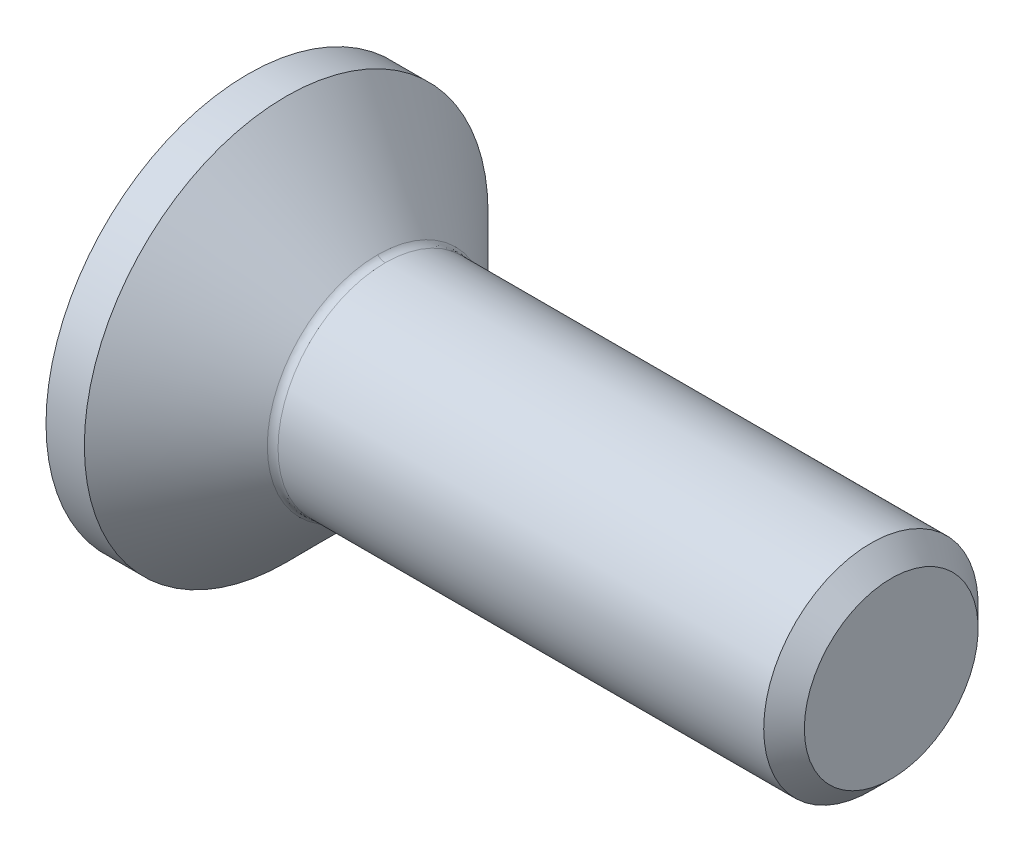
ISO-10303-21;
HEADER;
FILE_DESCRIPTION(('STEP AP214'),'2;1');
FILE_NAME('part.step','',(''),(''),'','','');
FILE_SCHEMA(('AUTOMOTIVE_DESIGN { 1 0 10303 214 1 1 1 1 }'));
ENDSEC;
DATA;
#1=APPLICATION_CONTEXT('core data for automotive mechanical design processes');
#2=APPLICATION_PROTOCOL_DEFINITION('international standard','automotive_design',2000,#1);
#3=PRODUCT_CONTEXT('',#1,'mechanical');
#4=PRODUCT('Part','Part','',(#3));
#5=PRODUCT_RELATED_PRODUCT_CATEGORY('part','',(#4));
#6=PRODUCT_DEFINITION_FORMATION('','',#4);
#7=PRODUCT_DEFINITION_CONTEXT('part definition',#1,'design');
#8=PRODUCT_DEFINITION('design','',#6,#7);
#9=PRODUCT_DEFINITION_SHAPE('','',#8);
#10=(LENGTH_UNIT() NAMED_UNIT(*) SI_UNIT(.MILLI.,.METRE.));
#11=(NAMED_UNIT(*) PLANE_ANGLE_UNIT() SI_UNIT($,.RADIAN.));
#12=(NAMED_UNIT(*) SI_UNIT($,.STERADIAN.) SOLID_ANGLE_UNIT());
#13=UNCERTAINTY_MEASURE_WITH_UNIT(LENGTH_MEASURE(1.E-05),#10,'distance_accuracy_value','');
#14=(GEOMETRIC_REPRESENTATION_CONTEXT(3) GLOBAL_UNCERTAINTY_ASSIGNED_CONTEXT((#13)) GLOBAL_UNIT_ASSIGNED_CONTEXT((#10,
#11,#12)) REPRESENTATION_CONTEXT('',''));
#15=CARTESIAN_POINT('',(0.,0.,0.));
#16=DIRECTION('',(0.,0.,1.));
#17=DIRECTION('',(1.,0.,0.));
#18=AXIS2_PLACEMENT_3D('',#15,#16,#17);
#19=CARTESIAN_POINT('',(1.5,0.,-1.44337567297406));
#20=DIRECTION('',(1.,0.,0.));
#21=DIRECTION('',(0.,1.,0.));
#22=AXIS2_PLACEMENT_3D('',#19,#20,#21);
#23=PLANE('',#22);
#24=CARTESIAN_POINT('',(1.50000000003137,0.,0.));
#25=DIRECTION('',(-1.,0.,0.));
#26=DIRECTION('',(0.,0.,1.));
#27=AXIS2_PLACEMENT_3D('',#24,#25,#26);
#28=CIRCLE('',#27,1.25);
#29=CARTESIAN_POINT('',(1.50000000001604,0.625000000006822,-1.08253175474236));
#30=VERTEX_POINT('',#29);
#31=CARTESIAN_POINT('',(1.50000000001604,-0.62500000000682,-1.08253175474236));
#32=VERTEX_POINT('',#31);
#33=EDGE_CURVE('E26',#30,#32,#28,.T.);
#34=ORIENTED_EDGE('',*,*,#33,.F.);
#35=DIRECTION('',(0.,0.866025403784436,0.5));
#36=VECTOR('',#35,1.);
#37=CARTESIAN_POINT('',(1.50000000001001,0.,-1.44337567298406));
#38=LINE('',#37,#36);
#39=CARTESIAN_POINT('',(1.50000000000535,0.,-1.44337567297406));
#40=VERTEX_POINT('',#39);
#41=EDGE_CURVE('E191',#40,#30,#38,.T.);
#42=ORIENTED_EDGE('',*,*,#41,.F.);
#43=DIRECTION('',(0.,0.866025403784437,-0.5));
#44=VECTOR('',#43,1.);
#45=CARTESIAN_POINT('',(1.5000000000207,-1.25000000001,-0.721687836497033));
#46=LINE('',#45,#44);
#47=EDGE_CURVE('E152',#32,#40,#46,.T.);
#48=ORIENTED_EDGE('',*,*,#47,.F.);
#49=EDGE_LOOP('',(#34,#42,#48));
#50=FACE_BOUND('',#49,.T.);
#51=ADVANCED_FACE('F15',(#50),#23,.F.);
#52=CARTESIAN_POINT('',(1.5,-1.25,0.721687836487032));
#53=DIRECTION('',(0.,1.,0.));
#54=DIRECTION('',(1.,0.,0.));
#55=AXIS2_PLACEMENT_3D('',#52,#53,#54);
#56=PLANE('',#55);
#57=DIRECTION('',(-1.,0.,0.));
#58=VECTOR('',#57,1.);
#59=CARTESIAN_POINT('',(1.50000000001,-1.25000000001,-0.721687836497035));
#60=LINE('',#59,#58);
#61=CARTESIAN_POINT('',(1.50000000000536,-1.25000000000227,-0.721687836485721));
#62=VERTEX_POINT('',#61);
#63=CARTESIAN_POINT('',(0.,-1.25,-0.721687836487034));
#64=VERTEX_POINT('',#63);
#65=EDGE_CURVE('E143',#62,#64,#60,.T.);
#66=ORIENTED_EDGE('',*,*,#65,.T.);
#67=DIRECTION('',(0.,0.,1.));
#68=VECTOR('',#67,1.);
#69=CARTESIAN_POINT('',(0.,-1.25000000001,0.));
#70=LINE('',#69,#68);
#71=CARTESIAN_POINT('',(0.,-1.25,0.721687836487032));
#72=VERTEX_POINT('',#71);
#73=EDGE_CURVE('E128',#64,#72,#70,.T.);
#74=ORIENTED_EDGE('',*,*,#73,.T.);
#75=DIRECTION('',(-1.,0.,0.));
#76=VECTOR('',#75,1.);
#77=CARTESIAN_POINT('',(1.50000000001,-1.25000000001,0.721687836497032));
#78=LINE('',#77,#76);
#79=CARTESIAN_POINT('',(1.50000000000536,-1.25,0.721687836487032));
#80=VERTEX_POINT('',#79);
#81=EDGE_CURVE('E10',#80,#72,#78,.T.);
#82=ORIENTED_EDGE('',*,*,#81,.F.);
#83=DIRECTION('',(0.,0.,-1.));
#84=VECTOR('',#83,1.);
#85=CARTESIAN_POINT('',(1.50000000001001,-1.25000000001,0.721687836497032));
#86=LINE('',#85,#84);
#87=CARTESIAN_POINT('',(1.50000000001604,-1.25000000001364,0.));
#88=VERTEX_POINT('',#87);
#89=EDGE_CURVE('E171',#80,#88,#86,.T.);
#90=ORIENTED_EDGE('',*,*,#89,.T.);
#91=DIRECTION('',(0.,0.,-1.));
#92=VECTOR('',#91,1.);
#93=CARTESIAN_POINT('',(1.5000000000207,-1.25000000001,0.721687836497032));
#94=LINE('',#93,#92);
#95=EDGE_CURVE('E147',#88,#62,#94,.T.);
#96=ORIENTED_EDGE('',*,*,#95,.T.);
#97=EDGE_LOOP('',(#66,#74,#82,#90,#96));
#98=FACE_BOUND('',#97,.T.);
#99=ADVANCED_FACE('F144',(#98),#56,.T.);
#100=CARTESIAN_POINT('',(1.5,0.,1.44337567297406));
#101=DIRECTION('',(0.,0.5,-0.866025403784438));
#102=DIRECTION('',(-1.,0.,0.));
#103=AXIS2_PLACEMENT_3D('',#100,#101,#102);
#104=PLANE('',#103);
#105=ORIENTED_EDGE('',*,*,#81,.T.);
#106=DIRECTION('',(0.,0.866025403784436,0.5));
#107=VECTOR('',#106,1.);
#108=CARTESIAN_POINT('',(0.,-1.25000000001,0.721687836497032));
#109=LINE('',#108,#107);
#110=CARTESIAN_POINT('',(0.,0.,1.44337567297406));
#111=VERTEX_POINT('',#110);
#112=EDGE_CURVE('E137',#72,#111,#109,.T.);
#113=ORIENTED_EDGE('',*,*,#112,.T.);
#114=DIRECTION('',(-1.,0.,0.));
#115=VECTOR('',#114,1.);
#116=CARTESIAN_POINT('',(1.50000000001,0.,1.44337567298407));
#117=LINE('',#116,#115);
#118=CARTESIAN_POINT('',(1.50000000000536,0.,1.44337567297406));
#119=VERTEX_POINT('',#118);
#120=EDGE_CURVE('E188',#119,#111,#117,.T.);
#121=ORIENTED_EDGE('',*,*,#120,.F.);
#122=DIRECTION('',(0.,-0.866025403784436,-0.5));
#123=VECTOR('',#122,1.);
#124=CARTESIAN_POINT('',(1.50000000001001,0.,1.44337567298406));
#125=LINE('',#124,#123);
#126=CARTESIAN_POINT('',(1.50000000001604,-0.625000000006822,1.08253175474236));
#127=VERTEX_POINT('',#126);
#128=EDGE_CURVE('E176',#119,#127,#125,.T.);
#129=ORIENTED_EDGE('',*,*,#128,.T.);
#130=DIRECTION('',(0.,-0.866025403784436,-0.5));
#131=VECTOR('',#130,1.);
#132=CARTESIAN_POINT('',(1.5000000000207,0.,1.44337567298406));
#133=LINE('',#132,#131);
#134=EDGE_CURVE('E168',#127,#80,#133,.T.);
#135=ORIENTED_EDGE('',*,*,#134,.T.);
#136=EDGE_LOOP('',(#105,#113,#121,#129,#135));
#137=FACE_BOUND('',#136,.T.);
#138=ADVANCED_FACE('F307',(#137),#104,.T.);
#139=CARTESIAN_POINT('',(1.5,1.25,-0.721687836487031));
#140=DIRECTION('',(0.,-1.,0.));
#141=DIRECTION('',(0.,0.,-1.));
#142=AXIS2_PLACEMENT_3D('',#139,#140,#141);
#143=PLANE('',#142);
#144=DIRECTION('',(-1.,0.,0.));
#145=VECTOR('',#144,1.);
#146=CARTESIAN_POINT('',(1.50000000001,1.25000000001,0.721687836497033));
#147=LINE('',#146,#145);
#148=CARTESIAN_POINT('',(1.50000000000091,1.24999999999867,0.721687836487799));
#149=VERTEX_POINT('',#148);
#150=CARTESIAN_POINT('',(0.,1.25,0.721687836487032));
#151=VERTEX_POINT('',#150);
#152=EDGE_CURVE('E187',#149,#151,#147,.T.);
#153=ORIENTED_EDGE('',*,*,#152,.T.);
#154=DIRECTION('',(0.,0.,-1.));
#155=VECTOR('',#154,1.);
#156=CARTESIAN_POINT('',(0.,1.25000000001,0.));
#157=LINE('',#156,#155);
#158=CARTESIAN_POINT('',(0.,1.25,-0.721687836487031));
#159=VERTEX_POINT('',#158);
#160=EDGE_CURVE('E140',#151,#159,#157,.T.);
#161=ORIENTED_EDGE('',*,*,#160,.T.);
#162=DIRECTION('',(1.,0.,0.));
#163=VECTOR('',#162,1.);
#164=CARTESIAN_POINT('',(1.50000000001,1.25000000001,-0.721687836497031));
#165=LINE('',#164,#163);
#166=CARTESIAN_POINT('',(1.50000000000357,1.25,-0.721687836487031));
#167=VERTEX_POINT('',#166);
#168=EDGE_CURVE('E267',#159,#167,#165,.T.);
#169=ORIENTED_EDGE('',*,*,#168,.T.);
#170=DIRECTION('',(0.,0.,1.));
#171=VECTOR('',#170,1.);
#172=CARTESIAN_POINT('',(1.50000000001001,1.25000000001,-0.721687836497031));
#173=LINE('',#172,#171);
#174=CARTESIAN_POINT('',(1.5000000000116,1.25000000001364,0.));
#175=VERTEX_POINT('',#174);
#176=EDGE_CURVE('E204',#167,#175,#173,.T.);
#177=ORIENTED_EDGE('',*,*,#176,.T.);
#178=DIRECTION('',(0.,0.,1.));
#179=VECTOR('',#178,1.);
#180=CARTESIAN_POINT('',(1.50000000001182,1.25000000001,-0.721687836497031));
#181=LINE('',#180,#179);
#182=EDGE_CURVE('E234',#175,#149,#181,.T.);
#183=ORIENTED_EDGE('',*,*,#182,.T.);
#184=EDGE_LOOP('',(#153,#161,#169,#177,#183));
#185=FACE_BOUND('',#184,.T.);
#186=ADVANCED_FACE('F424',(#185),#143,.T.);
#187=CARTESIAN_POINT('',(1.50000000002137,0.,0.));
#188=DIRECTION('',(-1.,0.,0.));
#189=DIRECTION('',(0.,0.,1.));
#190=AXIS2_PLACEMENT_3D('',#187,#188,#189);
#191=CONICAL_SURFACE('',#190,1.25,1.047197551);
#192=CARTESIAN_POINT('',(2.22168783665211,0.,0.));
#193=VERTEX_POINT('',#192);
#194=VERTEX_LOOP('',#193);
#195=FACE_BOUND('',#194,.T.);
#196=CARTESIAN_POINT('',(1.50000000003137,0.,0.));
#197=DIRECTION('',(-1.,0.,0.));
#198=DIRECTION('',(0.,0.,1.));
#199=AXIS2_PLACEMENT_3D('',#196,#197,#198);
#200=CIRCLE('',#199,1.25);
#201=CARTESIAN_POINT('',(1.50000000001604,0.625000000006821,1.08253175474236));
#202=VERTEX_POINT('',#201);
#203=EDGE_CURVE('E172',#127,#202,#200,.T.);
#204=ORIENTED_EDGE('',*,*,#203,.T.);
#205=CARTESIAN_POINT('',(1.50000000003137,0.,0.));
#206=DIRECTION('',(-1.,0.,0.));
#207=DIRECTION('',(0.,0.,1.));
#208=AXIS2_PLACEMENT_3D('',#205,#206,#207);
#209=CIRCLE('',#208,1.25);
#210=EDGE_CURVE('E236',#202,#175,#209,.T.);
#211=ORIENTED_EDGE('',*,*,#210,.T.);
#212=CARTESIAN_POINT('',(1.50000000003137,0.,0.));
#213=DIRECTION('',(-1.,0.,0.));
#214=DIRECTION('',(0.,0.,1.));
#215=AXIS2_PLACEMENT_3D('',#212,#213,#214);
#216=CIRCLE('',#215,1.25);
#217=EDGE_CURVE('E209',#175,#30,#216,.T.);
#218=ORIENTED_EDGE('',*,*,#217,.T.);
#219=ORIENTED_EDGE('',*,*,#33,.T.);
#220=CARTESIAN_POINT('',(1.50000000003137,0.,0.));
#221=DIRECTION('',(-1.,0.,0.));
#222=DIRECTION('',(0.,0.,1.));
#223=AXIS2_PLACEMENT_3D('',#220,#221,#222);
#224=CIRCLE('',#223,1.25);
#225=EDGE_CURVE('E195',#32,#88,#224,.T.);
#226=ORIENTED_EDGE('',*,*,#225,.T.);
#227=CARTESIAN_POINT('',(1.50000000003137,0.,0.));
#228=DIRECTION('',(-1.,0.,0.));
#229=DIRECTION('',(0.,0.,1.));
#230=AXIS2_PLACEMENT_3D('',#227,#228,#229);
#231=CIRCLE('',#230,1.25);
#232=EDGE_CURVE('E213',#88,#127,#231,.T.);
#233=ORIENTED_EDGE('',*,*,#232,.T.);
#234=EDGE_LOOP('',(#204,#211,#218,#219,#226,#233));
#235=FACE_BOUND('',#234,.T.);
#236=ADVANCED_FACE('F249',(#195,#235),#191,.F.);
#237=CARTESIAN_POINT('',(1.5,0.,-1.44337567297406));
#238=DIRECTION('',(1.,0.,0.));
#239=DIRECTION('',(0.,1.,0.));
#240=AXIS2_PLACEMENT_3D('',#237,#238,#239);
#241=PLANE('',#240);
#242=ORIENTED_EDGE('',*,*,#210,.F.);
#243=DIRECTION('',(0.,-0.866025403784436,0.5));
#244=VECTOR('',#243,1.);
#245=CARTESIAN_POINT('',(1.50000000001001,1.25000000001,0.721687836497032));
#246=LINE('',#245,#244);
#247=EDGE_CURVE('E164',#149,#202,#246,.T.);
#248=ORIENTED_EDGE('',*,*,#247,.F.);
#249=ORIENTED_EDGE('',*,*,#182,.F.);
#250=EDGE_LOOP('',(#242,#248,#249));
#251=FACE_BOUND('',#250,.T.);
#252=ADVANCED_FACE('F482',(#251),#241,.F.);
#253=CARTESIAN_POINT('',(0.,0.,0.));
#254=DIRECTION('',(1.,0.,0.));
#255=DIRECTION('',(0.,1.,0.));
#256=AXIS2_PLACEMENT_3D('',#253,#254,#255);
#257=PLANE('',#256);
#258=DIRECTION('',(0.,0.866025403784437,-0.5));
#259=VECTOR('',#258,1.);
#260=CARTESIAN_POINT('',(0.,0.,1.44337567298406));
#261=LINE('',#260,#259);
#262=EDGE_CURVE('E183',#111,#151,#261,.T.);
#263=ORIENTED_EDGE('',*,*,#262,.F.);
#264=ORIENTED_EDGE('',*,*,#112,.F.);
#265=ORIENTED_EDGE('',*,*,#73,.F.);
#266=DIRECTION('',(0.,-0.866025403784437,0.5));
#267=VECTOR('',#266,1.);
#268=CARTESIAN_POINT('',(0.,0.,-1.44337567298406));
#269=LINE('',#268,#267);
#270=CARTESIAN_POINT('',(0.,0.,-1.44337567297406));
#271=VERTEX_POINT('',#270);
#272=EDGE_CURVE('E135',#271,#64,#269,.T.);
#273=ORIENTED_EDGE('',*,*,#272,.F.);
#274=DIRECTION('',(0.,-0.866025403784436,-0.5));
#275=VECTOR('',#274,1.);
#276=CARTESIAN_POINT('',(0.,1.25000000001,-0.721687836497031));
#277=LINE('',#276,#275);
#278=EDGE_CURVE('E274',#159,#271,#277,.T.);
#279=ORIENTED_EDGE('',*,*,#278,.F.);
#280=ORIENTED_EDGE('',*,*,#160,.F.);
#281=EDGE_LOOP('',(#263,#264,#265,#273,#279,#280));
#282=FACE_BOUND('',#281,.T.);
#283=CARTESIAN_POINT('',(0.,0.,0.));
#284=DIRECTION('',(1.,0.,0.));
#285=DIRECTION('',(0.,0.,-1.));
#286=AXIS2_PLACEMENT_3D('',#283,#284,#285);
#287=CIRCLE('',#286,3.765);
#288=CARTESIAN_POINT('',(0.,0.,-3.765));
#289=VERTEX_POINT('',#288);
#290=EDGE_CURVE('E222',#289,#289,#287,.T.);
#291=ORIENTED_EDGE('',*,*,#290,.F.);
#292=EDGE_LOOP('',(#291));
#293=FACE_BOUND('',#292,.T.);
#294=ADVANCED_FACE('F131',(#282,#293),#257,.F.);
#295=CARTESIAN_POINT('',(2.56284271247462,2.,0.));
#296=CARTESIAN_POINT('',(2.56284271247462,2.,-4.));
#297=CARTESIAN_POINT('',(2.56284271247462,-2.,-4.));
#298=CARTESIAN_POINT('',(2.56284271247462,-2.,0.));
#299=CARTESIAN_POINT('',(2.50909049206168,2.,0.));
#300=CARTESIAN_POINT('',(2.50909049206168,2.,-4.));
#301=CARTESIAN_POINT('',(2.50909049206168,-2.,-4.));
#302=CARTESIAN_POINT('',(2.50909049206168,-2.,0.));
#303=CARTESIAN_POINT('',(2.45942991579513,2.02057008420487,0.));
#304=CARTESIAN_POINT('',(2.45942991579513,2.02057008420487,-4.04114016840973));
#305=CARTESIAN_POINT('',(2.45942991579513,-2.02057008420487,-4.04114016840973));
#306=CARTESIAN_POINT('',(2.45942991579513,-2.02057008420487,0.));
#307=CARTESIAN_POINT('',(2.42142135623731,2.05857864376269,0.));
#308=CARTESIAN_POINT('',(2.42142135623731,2.05857864376269,-4.11715728752538));
#309=CARTESIAN_POINT('',(2.42142135623731,-2.05857864376269,-4.11715728752538));
#310=CARTESIAN_POINT('',(2.42142135623731,-2.05857864376269,0.));
#311=(BOUNDED_SURFACE() B_SPLINE_SURFACE(3,3,((#295,#296,#297,#298),(#299,#300,#301,#302),(#303,
#304,#305,#306),(#307,#308,#309,#310)),.UNSPECIFIED.,.F.,.F.,
.F.) B_SPLINE_SURFACE_WITH_KNOTS((4,4),(4,4),(0.,1.),(0.,1.),
.UNSPECIFIED.) GEOMETRIC_REPRESENTATION_ITEM() RATIONAL_B_SPLINE_SURFACE(((1.,0.333333333333333,
0.333333333333333,1.),(0.949253021674192,0.316417673891397,0.316417673891397,0.949253021674192),
(0.949253021674192,0.316417673891397,0.316417673891397,0.949253021674192),(1.,0.333333333333333,
0.333333333333333,1.))) REPRESENTATION_ITEM('') SURFACE());
#312=CARTESIAN_POINT('',(2.56284271248462,2.20000000001,0.));
#313=DIRECTION('',(0.,0.,-1.));
#314=DIRECTION('',(0.,1.,0.));
#315=AXIS2_PLACEMENT_3D('',#312,#313,#314);
#316=CIRCLE('',#315,0.2);
#317=CARTESIAN_POINT('',(2.56284271247462,2.,0.));
#318=VERTEX_POINT('',#317);
#319=CARTESIAN_POINT('',(2.42142135623731,2.05857864376269,0.));
#320=VERTEX_POINT('',#319);
#321=EDGE_CURVE('E182',#318,#320,#316,.T.);
#322=CARTESIAN_POINT('',(2.56284271248462,0.,0.));
#323=DIRECTION('',(1.,0.,0.));
#324=DIRECTION('',(0.,0.,1.));
#325=AXIS2_PLACEMENT_3D('',#322,#323,#324);
#326=CIRCLE('',#325,2.);
#327=CARTESIAN_POINT('',(2.56284271247462,-2.,0.));
#328=VERTEX_POINT('',#327);
#329=EDGE_CURVE('E199',#328,#318,#326,.T.);
#330=CARTESIAN_POINT('',(2.56284271248462,-2.20000000001,0.));
#331=DIRECTION('',(0.,0.,1.));
#332=DIRECTION('',(0.,-1.,0.));
#333=AXIS2_PLACEMENT_3D('',#330,#331,#332);
#334=CIRCLE('',#333,0.2);
#335=CARTESIAN_POINT('',(2.42142135623731,-2.05857864376269,0.));
#336=VERTEX_POINT('',#335);
#337=EDGE_CURVE('E181',#328,#336,#334,.T.);
#338=CARTESIAN_POINT('',(2.42142135624731,0.,0.));
#339=DIRECTION('',(-1.,0.,0.));
#340=DIRECTION('',(0.,-1.,0.));
#341=AXIS2_PLACEMENT_3D('',#338,#339,#340);
#342=CIRCLE('',#341,2.0585786);
#343=EDGE_CURVE('E202',#320,#336,#342,.T.);
#344=ORIENTED_EDGE('',*,*,#321,.F.);
#345=ORIENTED_EDGE('',*,*,#329,.F.);
#346=ORIENTED_EDGE('',*,*,#337,.T.);
#347=ORIENTED_EDGE('',*,*,#343,.F.);
#348=EDGE_LOOP('',(#344,#345,#346,#347));
#349=FACE_BOUND('',#348,.T.);
#350=ADVANCED_FACE('F490',(#349),#311,.F.);
#351=CARTESIAN_POINT('',(1.5,0.,-1.44337567297406));
#352=DIRECTION('',(0.,-0.5,0.866025403784438));
#353=DIRECTION('',(-1.,0.,0.));
#354=AXIS2_PLACEMENT_3D('',#351,#352,#353);
#355=PLANE('',#354);
#356=ORIENTED_EDGE('',*,*,#168,.F.);
#357=ORIENTED_EDGE('',*,*,#278,.T.);
#358=DIRECTION('',(-1.,0.,0.));
#359=VECTOR('',#358,1.);
#360=CARTESIAN_POINT('',(1.50000000001,0.,-1.44337567298406));
#361=LINE('',#360,#359);
#362=EDGE_CURVE('E157',#40,#271,#361,.T.);
#363=ORIENTED_EDGE('',*,*,#362,.F.);
#364=ORIENTED_EDGE('',*,*,#41,.T.);
#365=DIRECTION('',(0.,0.866025403784436,0.5));
#366=VECTOR('',#365,1.);
#367=CARTESIAN_POINT('',(1.5000000000207,0.,-1.44337567298406));
#368=LINE('',#367,#366);
#369=EDGE_CURVE('E208',#30,#167,#368,.T.);
#370=ORIENTED_EDGE('',*,*,#369,.T.);
#371=EDGE_LOOP('',(#356,#357,#363,#364,#370));
#372=FACE_BOUND('',#371,.T.);
#373=ADVANCED_FACE('F494',(#372),#355,.T.);
#374=CARTESIAN_POINT('',(1.5,-1.25,-0.721687836487033));
#375=DIRECTION('',(0.,0.5,0.866025403784439));
#376=DIRECTION('',(1.,0.,0.));
#377=AXIS2_PLACEMENT_3D('',#374,#375,#376);
#378=PLANE('',#377);
#379=ORIENTED_EDGE('',*,*,#362,.T.);
#380=ORIENTED_EDGE('',*,*,#272,.T.);
#381=ORIENTED_EDGE('',*,*,#65,.F.);
#382=DIRECTION('',(0.,0.866025403784437,-0.5));
#383=VECTOR('',#382,1.);
#384=CARTESIAN_POINT('',(1.50000000001001,-1.25000000001,-0.721687836497033));
#385=LINE('',#384,#383);
#386=EDGE_CURVE('E192',#62,#32,#385,.T.);
#387=ORIENTED_EDGE('',*,*,#386,.T.);
#388=ORIENTED_EDGE('',*,*,#47,.T.);
#389=EDGE_LOOP('',(#379,#380,#381,#387,#388));
#390=FACE_BOUND('',#389,.T.);
#391=ADVANCED_FACE('F154',(#390),#378,.T.);
#392=CARTESIAN_POINT('',(1.5,1.25,0.721687836487032));
#393=DIRECTION('',(0.,-0.5,-0.866025403784438));
#394=DIRECTION('',(0.,-0.866025403784438,0.5));
#395=AXIS2_PLACEMENT_3D('',#392,#393,#394);
#396=PLANE('',#395);
#397=ORIENTED_EDGE('',*,*,#120,.T.);
#398=ORIENTED_EDGE('',*,*,#262,.T.);
#399=ORIENTED_EDGE('',*,*,#152,.F.);
#400=ORIENTED_EDGE('',*,*,#247,.T.);
#401=DIRECTION('',(0.,-0.866025403784436,0.5));
#402=VECTOR('',#401,1.);
#403=CARTESIAN_POINT('',(1.5000000000207,1.25000000001,0.721687836497032));
#404=LINE('',#403,#402);
#405=EDGE_CURVE('E19',#202,#119,#404,.T.);
#406=ORIENTED_EDGE('',*,*,#405,.T.);
#407=EDGE_LOOP('',(#397,#398,#399,#400,#406));
#408=FACE_BOUND('',#407,.T.);
#409=ADVANCED_FACE('F303',(#408),#396,.T.);
#410=CARTESIAN_POINT('',(0.714999999900101,0.,0.));
#411=DIRECTION('',(-1.,0.,0.));
#412=DIRECTION('',(0.,0.,1.));
#413=AXIS2_PLACEMENT_3D('',#410,#411,#412);
#414=CONICAL_SURFACE('',#413,3.765,0.7853981634);
#415=CARTESIAN_POINT('',(2.42142135624731,0.,0.));
#416=DIRECTION('',(-1.,0.,0.));
#417=DIRECTION('',(0.,-1.,0.));
#418=AXIS2_PLACEMENT_3D('',#415,#416,#417);
#419=CIRCLE('',#418,2.0585786);
#420=EDGE_CURVE('E177',#336,#320,#419,.T.);
#421=ORIENTED_EDGE('',*,*,#420,.T.);
#422=ORIENTED_EDGE('',*,*,#343,.T.);
#423=EDGE_LOOP('',(#421,#422));
#424=FACE_BOUND('',#423,.T.);
#425=CARTESIAN_POINT('',(0.714999999910101,0.,0.));
#426=DIRECTION('',(1.,0.,0.));
#427=DIRECTION('',(0.,0.,1.));
#428=AXIS2_PLACEMENT_3D('',#425,#426,#427);
#429=CIRCLE('',#428,3.765);
#430=CARTESIAN_POINT('',(0.714999999910101,0.,3.765));
#431=VERTEX_POINT('',#430);
#432=EDGE_CURVE('E218',#431,#431,#429,.T.);
#433=ORIENTED_EDGE('',*,*,#432,.T.);
#434=EDGE_LOOP('',(#433));
#435=FACE_BOUND('',#434,.T.);
#436=ADVANCED_FACE('F467',(#424,#435),#414,.T.);
#437=CARTESIAN_POINT('',(-0.587069180985524,0.,0.));
#438=DIRECTION('',(-1.,0.,0.));
#439=DIRECTION('',(0.,0.,1.));
#440=AXIS2_PLACEMENT_3D('',#437,#438,#439);
#441=CYLINDRICAL_SURFACE('',#440,2.);
#442=CARTESIAN_POINT('',(11.62100000001,0.,0.));
#443=DIRECTION('',(-1.,0.,0.));
#444=DIRECTION('',(0.,0.,1.));
#445=AXIS2_PLACEMENT_3D('',#442,#443,#444);
#446=CIRCLE('',#445,2.);
#447=CARTESIAN_POINT('',(11.62100000001,0.,2.));
#448=VERTEX_POINT('',#447);
#449=EDGE_CURVE('E203',#448,#448,#446,.T.);
#450=ORIENTED_EDGE('',*,*,#449,.T.);
#451=EDGE_LOOP('',(#450));
#452=FACE_BOUND('',#451,.T.);
#453=CARTESIAN_POINT('',(2.56284271248462,0.,0.));
#454=DIRECTION('',(1.,0.,0.));
#455=DIRECTION('',(0.,0.,1.));
#456=AXIS2_PLACEMENT_3D('',#453,#454,#455);
#457=CIRCLE('',#456,2.);
#458=EDGE_CURVE('E170',#318,#328,#457,.T.);
#459=ORIENTED_EDGE('',*,*,#458,.T.);
#460=ORIENTED_EDGE('',*,*,#329,.T.);
#461=EDGE_LOOP('',(#459,#460));
#462=FACE_BOUND('',#461,.T.);
#463=ADVANCED_FACE('F471',(#452,#462),#441,.T.);
#464=CARTESIAN_POINT('',(11.6210000000478,0.,0.));
#465=DIRECTION('',(-1.,0.,0.));
#466=DIRECTION('',(0.,0.,1.));
#467=AXIS2_PLACEMENT_3D('',#464,#465,#466);
#468=CONICAL_SURFACE('',#467,2.,0.7853981635);
#469=CARTESIAN_POINT('',(12.0000000001241,0.,0.));
#470=DIRECTION('',(-1.,0.,0.));
#471=DIRECTION('',(0.,0.,1.));
#472=AXIS2_PLACEMENT_3D('',#469,#470,#471);
#473=CIRCLE('',#472,1.621);
#474=CARTESIAN_POINT('',(12.0000000001241,0.,1.621));
#475=VERTEX_POINT('',#474);
#476=EDGE_CURVE('E210',#475,#475,#473,.T.);
#477=ORIENTED_EDGE('',*,*,#476,.T.);
#478=EDGE_LOOP('',(#477));
#479=FACE_BOUND('',#478,.T.);
#480=ORIENTED_EDGE('',*,*,#449,.F.);
#481=EDGE_LOOP('',(#480));
#482=FACE_BOUND('',#481,.T.);
#483=ADVANCED_FACE('F449',(#479,#482),#468,.T.);
#484=CARTESIAN_POINT('',(11.8531386861314,0.,0.));
#485=DIRECTION('',(1.,0.,0.));
#486=DIRECTION('',(0.,0.,-1.));
#487=AXIS2_PLACEMENT_3D('',#484,#485,#486);
#488=CYLINDRICAL_SURFACE('',#487,3.765);
#489=ORIENTED_EDGE('',*,*,#290,.T.);
#490=EDGE_LOOP('',(#489));
#491=FACE_BOUND('',#490,.T.);
#492=ORIENTED_EDGE('',*,*,#432,.F.);
#493=EDGE_LOOP('',(#492));
#494=FACE_BOUND('',#493,.T.);
#495=ADVANCED_FACE('F445',(#491,#494),#488,.T.);
#496=CARTESIAN_POINT('',(1.5,0.,-1.44337567297406));
#497=DIRECTION('',(1.,0.,0.));
#498=DIRECTION('',(0.,1.,0.));
#499=AXIS2_PLACEMENT_3D('',#496,#497,#498);
#500=PLANE('',#499);
#501=ORIENTED_EDGE('',*,*,#217,.F.);
#502=ORIENTED_EDGE('',*,*,#176,.F.);
#503=ORIENTED_EDGE('',*,*,#369,.F.);
#504=EDGE_LOOP('',(#501,#502,#503));
#505=FACE_BOUND('',#504,.T.);
#506=ADVANCED_FACE('F416',(#505),#500,.F.);
#507=CARTESIAN_POINT('',(1.5,0.,-1.44337567297406));
#508=DIRECTION('',(1.,0.,0.));
#509=DIRECTION('',(0.,1.,0.));
#510=AXIS2_PLACEMENT_3D('',#507,#508,#509);
#511=PLANE('',#510);
#512=ORIENTED_EDGE('',*,*,#203,.F.);
#513=ORIENTED_EDGE('',*,*,#128,.F.);
#514=ORIENTED_EDGE('',*,*,#405,.F.);
#515=EDGE_LOOP('',(#512,#513,#514));
#516=FACE_BOUND('',#515,.T.);
#517=ADVANCED_FACE('F17',(#516),#511,.F.);
#518=CARTESIAN_POINT('',(1.5,0.,-1.44337567297406));
#519=DIRECTION('',(1.,0.,0.));
#520=DIRECTION('',(0.,1.,0.));
#521=AXIS2_PLACEMENT_3D('',#518,#519,#520);
#522=PLANE('',#521);
#523=ORIENTED_EDGE('',*,*,#225,.F.);
#524=ORIENTED_EDGE('',*,*,#386,.F.);
#525=ORIENTED_EDGE('',*,*,#95,.F.);
#526=EDGE_LOOP('',(#523,#524,#525));
#527=FACE_BOUND('',#526,.T.);
#528=ADVANCED_FACE('F255',(#527),#522,.F.);
#529=CARTESIAN_POINT('',(2.56284271247462,-2.,0.));
#530=CARTESIAN_POINT('',(2.56284271247462,-2.,4.));
#531=CARTESIAN_POINT('',(2.56284271247462,2.,4.));
#532=CARTESIAN_POINT('',(2.56284271247462,2.,0.));
#533=CARTESIAN_POINT('',(2.50909049206168,-2.,0.));
#534=CARTESIAN_POINT('',(2.50909049206168,-2.,4.));
#535=CARTESIAN_POINT('',(2.50909049206168,2.,4.));
#536=CARTESIAN_POINT('',(2.50909049206168,2.,0.));
#537=CARTESIAN_POINT('',(2.45942991579513,-2.02057008420487,0.));
#538=CARTESIAN_POINT('',(2.45942991579513,-2.02057008420487,4.04114016840973));
#539=CARTESIAN_POINT('',(2.45942991579513,2.02057008420487,4.04114016840973));
#540=CARTESIAN_POINT('',(2.45942991579513,2.02057008420487,0.));
#541=CARTESIAN_POINT('',(2.42142135623731,-2.05857864376269,0.));
#542=CARTESIAN_POINT('',(2.42142135623731,-2.05857864376269,4.11715728752538));
#543=CARTESIAN_POINT('',(2.42142135623731,2.05857864376269,4.11715728752538));
#544=CARTESIAN_POINT('',(2.42142135623731,2.05857864376269,0.));
#545=(BOUNDED_SURFACE() B_SPLINE_SURFACE(3,3,((#529,#530,#531,#532),(#533,#534,#535,#536),(#537,
#538,#539,#540),(#541,#542,#543,#544)),.UNSPECIFIED.,.F.,.F.,
.F.) B_SPLINE_SURFACE_WITH_KNOTS((4,4),(4,4),(0.,1.),(0.,1.),
.UNSPECIFIED.) GEOMETRIC_REPRESENTATION_ITEM() RATIONAL_B_SPLINE_SURFACE(((1.,0.333333333333333,
0.333333333333333,1.),(0.949253021674192,0.316417673891397,0.316417673891397,0.949253021674192),
(0.949253021674192,0.316417673891397,0.316417673891397,0.949253021674192),(1.,0.333333333333333,
0.333333333333333,1.))) REPRESENTATION_ITEM('') SURFACE());
#546=ORIENTED_EDGE('',*,*,#458,.F.);
#547=ORIENTED_EDGE('',*,*,#321,.T.);
#548=ORIENTED_EDGE('',*,*,#420,.F.);
#549=ORIENTED_EDGE('',*,*,#337,.F.);
#550=EDGE_LOOP('',(#546,#547,#548,#549));
#551=FACE_BOUND('',#550,.T.);
#552=ADVANCED_FACE('F434',(#551),#545,.F.);
#553=CARTESIAN_POINT('',(1.5,0.,-1.44337567297406));
#554=DIRECTION('',(1.,0.,0.));
#555=DIRECTION('',(0.,1.,0.));
#556=AXIS2_PLACEMENT_3D('',#553,#554,#555);
#557=PLANE('',#556);
#558=ORIENTED_EDGE('',*,*,#232,.F.);
#559=ORIENTED_EDGE('',*,*,#89,.F.);
#560=ORIENTED_EDGE('',*,*,#134,.F.);
#561=EDGE_LOOP('',(#558,#559,#560));
#562=FACE_BOUND('',#561,.T.);
#563=ADVANCED_FACE('F247',(#562),#557,.F.);
#564=CARTESIAN_POINT('',(12.,2.,0.));
#565=DIRECTION('',(-1.,0.,0.));
#566=DIRECTION('',(0.,0.,1.));
#567=AXIS2_PLACEMENT_3D('',#564,#565,#566);
#568=PLANE('',#567);
#569=ORIENTED_EDGE('',*,*,#476,.F.);
#570=EDGE_LOOP('',(#569));
#571=FACE_BOUND('',#570,.T.);
#572=ADVANCED_FACE('F460',(#571),#568,.F.);
#573=CLOSED_SHELL('',(#51,#99,#138,#186,#236,#252,#294,#350,#373,#391,#409,#436,#463,#483,#495,
#506,#517,#528,#552,#563,#572));
#574=MANIFOLD_SOLID_BREP('B1',#573);
#575=ADVANCED_BREP_SHAPE_REPRESENTATION('',(#18,#574),#14);
#576=SHAPE_DEFINITION_REPRESENTATION(#9,#575);
ENDSEC;
END-ISO-10303-21;
